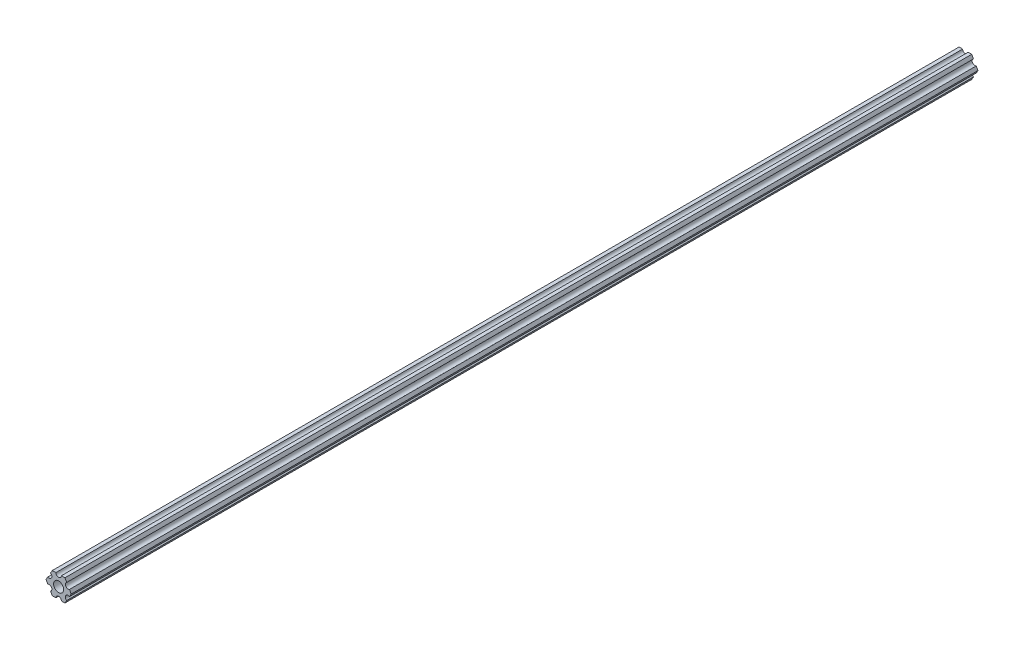
ISO-10303-21;
HEADER;
FILE_DESCRIPTION(('STEP AP214'),'2;1');
FILE_NAME('part.step','',(''),(''),'','','');
FILE_SCHEMA(('AUTOMOTIVE_DESIGN { 1 0 10303 214 1 1 1 1 }'));
ENDSEC;
DATA;
#1=APPLICATION_CONTEXT('core data for automotive mechanical design processes');
#2=APPLICATION_PROTOCOL_DEFINITION('international standard','automotive_design',2000,#1);
#3=PRODUCT_CONTEXT('',#1,'mechanical');
#4=PRODUCT('Part','Part','',(#3));
#5=PRODUCT_RELATED_PRODUCT_CATEGORY('part','',(#4));
#6=PRODUCT_DEFINITION_FORMATION('','',#4);
#7=PRODUCT_DEFINITION_CONTEXT('part definition',#1,'design');
#8=PRODUCT_DEFINITION('design','',#6,#7);
#9=PRODUCT_DEFINITION_SHAPE('','',#8);
#10=(LENGTH_UNIT() NAMED_UNIT(*) SI_UNIT(.MILLI.,.METRE.));
#11=(NAMED_UNIT(*) PLANE_ANGLE_UNIT() SI_UNIT($,.RADIAN.));
#12=(NAMED_UNIT(*) SI_UNIT($,.STERADIAN.) SOLID_ANGLE_UNIT());
#13=UNCERTAINTY_MEASURE_WITH_UNIT(LENGTH_MEASURE(1.E-05),#10,'distance_accuracy_value','');
#14=(GEOMETRIC_REPRESENTATION_CONTEXT(3) GLOBAL_UNCERTAINTY_ASSIGNED_CONTEXT((#13)) GLOBAL_UNIT_ASSIGNED_CONTEXT((#10,
#11,#12)) REPRESENTATION_CONTEXT('',''));
#15=CARTESIAN_POINT('',(0.,0.,0.));
#16=DIRECTION('',(0.,0.,1.));
#17=DIRECTION('',(1.,0.,0.));
#18=AXIS2_PLACEMENT_3D('',#15,#16,#17);
#19=CARTESIAN_POINT('',(6.29301142309098,-1.80018429024546,514.35));
#20=DIRECTION('',(-0.866025434075723,0.499999947533953,0.));
#21=DIRECTION('',(-0.499999947533953,-0.866025434075723,0.));
#22=AXIS2_PLACEMENT_3D('',#19,#20,#21);
#23=PLANE('',#22);
#24=DIRECTION('',(0.,0.,1.));
#25=VECTOR('',#24,1.);
#26=CARTESIAN_POINT('',(7.33234841870826,4.44212519169686E-07,514.35));
#27=LINE('',#26,#25);
#28=CARTESIAN_POINT('',(7.33234841870826,4.44212518961143E-07,0.));
#29=VERTEX_POINT('',#28);
#30=CARTESIAN_POINT('',(7.33234841870826,4.44212519315656E-07,527.05));
#31=VERTEX_POINT('',#30);
#32=EDGE_CURVE('E105',#29,#31,#27,.T.);
#33=ORIENTED_EDGE('',*,*,#32,.T.);
#34=DIRECTION('',(0.499999947533952,0.866025434075723,0.));
#35=VECTOR('',#34,1.);
#36=CARTESIAN_POINT('',(6.29301142309098,-1.80018429024546,527.05));
#37=LINE('',#36,#35);
#38=CARTESIAN_POINT('',(6.29301142309098,-1.80018429024546,527.05));
#39=VERTEX_POINT('',#38);
#40=EDGE_CURVE('E292',#39,#31,#37,.T.);
#41=ORIENTED_EDGE('',*,*,#40,.F.);
#42=DIRECTION('',(0.,0.,-1.));
#43=VECTOR('',#42,1.);
#44=CARTESIAN_POINT('',(6.29301142309098,-1.80018429024546,514.35));
#45=LINE('',#44,#43);
#46=CARTESIAN_POINT('',(6.29301142309098,-1.80018429024546,0.));
#47=VERTEX_POINT('',#46);
#48=EDGE_CURVE('E55',#39,#47,#45,.T.);
#49=ORIENTED_EDGE('',*,*,#48,.T.);
#50=DIRECTION('',(0.499999947533953,0.866025434075723,0.));
#51=VECTOR('',#50,1.);
#52=CARTESIAN_POINT('',(6.29301142309098,-1.80018429024546,0.));
#53=LINE('',#52,#51);
#54=EDGE_CURVE('E46',#47,#29,#53,.T.);
#55=ORIENTED_EDGE('',*,*,#54,.T.);
#56=EDGE_LOOP('',(#33,#41,#49,#55));
#57=FACE_BOUND('',#56,.T.);
#58=ADVANCED_FACE('F37',(#57),#23,.F.);
#59=CARTESIAN_POINT('',(7.33234841870826,4.44212519169686E-07,514.35));
#60=DIRECTION('',(-0.866025373493145,-0.500000052466056,0.));
#61=DIRECTION('',(0.500000052466056,-0.866025373493145,0.));
#62=AXIS2_PLACEMENT_3D('',#59,#60,#61);
#63=PLANE('',#62);
#64=DIRECTION('',(0.,0.,-1.));
#65=VECTOR('',#64,1.);
#66=CARTESIAN_POINT('',(6.29301120497139,1.80018505273895,514.35));
#67=LINE('',#66,#65);
#68=CARTESIAN_POINT('',(6.29301120497139,1.80018505273895,0.));
#69=VERTEX_POINT('',#68);
#70=CARTESIAN_POINT('',(6.29301120497139,1.80018505273895,527.05));
#71=VERTEX_POINT('',#70);
#72=EDGE_CURVE('E97',#69,#71,#67,.F.);
#73=ORIENTED_EDGE('',*,*,#72,.T.);
#74=DIRECTION('',(-0.500000052466056,0.866025373493145,0.));
#75=VECTOR('',#74,1.);
#76=CARTESIAN_POINT('',(7.33234841870826,4.44212519315656E-07,527.05));
#77=LINE('',#76,#75);
#78=EDGE_CURVE('E289',#31,#71,#77,.T.);
#79=ORIENTED_EDGE('',*,*,#78,.F.);
#80=ORIENTED_EDGE('',*,*,#32,.F.);
#81=DIRECTION('',(-0.500000052466056,0.866025373493145,0.));
#82=VECTOR('',#81,1.);
#83=CARTESIAN_POINT('',(7.33234841870826,4.44212519198905E-07,0.));
#84=LINE('',#83,#82);
#85=EDGE_CURVE('E160',#29,#69,#84,.T.);
#86=ORIENTED_EDGE('',*,*,#85,.T.);
#87=EDGE_LOOP('',(#73,#79,#80,#86));
#88=FACE_BOUND('',#87,.T.);
#89=ADVANCED_FACE('F341',(#88),#63,.F.);
#90=CARTESIAN_POINT('',(5.49926112168156,3.17500033315933,514.35));
#91=DIRECTION('',(0.,0.,-1.));
#92=DIRECTION('',(-1.,0.,0.));
#93=AXIS2_PLACEMENT_3D('',#90,#91,#92);
#94=CYLINDRICAL_SURFACE('',#93,1.5875);
#95=DIRECTION('',(0.,0.,1.));
#96=VECTOR('',#95,1.);
#97=CARTESIAN_POINT('',(4.70551103839172,4.54981561357972,514.35));
#98=LINE('',#97,#96);
#99=CARTESIAN_POINT('',(4.70551103839172,4.54981561357972,0.));
#100=VERTEX_POINT('',#99);
#101=CARTESIAN_POINT('',(4.70551103839172,4.54981561357972,527.05));
#102=VERTEX_POINT('',#101);
#103=EDGE_CURVE('E145',#100,#102,#98,.T.);
#104=ORIENTED_EDGE('',*,*,#103,.T.);
#105=CARTESIAN_POINT('',(5.49926112168156,3.17500033315933,527.05));
#106=DIRECTION('',(0.,0.,-1.));
#107=DIRECTION('',(1.,0.,0.));
#108=AXIS2_PLACEMENT_3D('',#105,#106,#107);
#109=CIRCLE('',#108,1.5875);
#110=EDGE_CURVE('E286',#71,#102,#109,.T.);
#111=ORIENTED_EDGE('',*,*,#110,.F.);
#112=ORIENTED_EDGE('',*,*,#72,.F.);
#113=CARTESIAN_POINT('',(5.49926112168156,3.17500033315933,0.));
#114=DIRECTION('',(0.,0.,-1.));
#115=DIRECTION('',(-1.,0.,0.));
#116=AXIS2_PLACEMENT_3D('',#113,#114,#115);
#117=CIRCLE('',#116,1.5875);
#118=EDGE_CURVE('E40',#69,#100,#117,.T.);
#119=ORIENTED_EDGE('',*,*,#118,.T.);
#120=EDGE_LOOP('',(#104,#111,#112,#119));
#121=FACE_BOUND('',#120,.T.);
#122=ADVANCED_FACE('F345',(#121),#94,.F.);
#123=CARTESIAN_POINT('',(4.70551103839172,4.54981561357972,514.35));
#124=DIRECTION('',(-0.866025373493151,-0.500000052466046,0.));
#125=DIRECTION('',(0.500000052466046,-0.866025373493151,0.));
#126=AXIS2_PLACEMENT_3D('',#123,#124,#125);
#127=PLANE('',#126);
#128=DIRECTION('',(0.,0.,1.));
#129=VECTOR('',#128,1.);
#130=CARTESIAN_POINT('',(3.66617382465481,6.35000022210627,514.35));
#131=LINE('',#130,#129);
#132=CARTESIAN_POINT('',(3.66617382465481,6.35000022210627,-1.11022302462516E-13));
#133=VERTEX_POINT('',#132);
#134=CARTESIAN_POINT('',(3.66617382465481,6.35000022210627,527.05));
#135=VERTEX_POINT('',#134);
#136=EDGE_CURVE('E132',#133,#135,#131,.T.);
#137=ORIENTED_EDGE('',*,*,#136,.T.);
#138=DIRECTION('',(-0.500000052466045,0.866025373493151,0.));
#139=VECTOR('',#138,1.);
#140=CARTESIAN_POINT('',(4.70551103839172,4.54981561357972,527.05));
#141=LINE('',#140,#139);
#142=EDGE_CURVE('E284',#102,#135,#141,.T.);
#143=ORIENTED_EDGE('',*,*,#142,.F.);
#144=ORIENTED_EDGE('',*,*,#103,.F.);
#145=DIRECTION('',(-0.500000052466046,0.866025373493151,0.));
#146=VECTOR('',#145,1.);
#147=CARTESIAN_POINT('',(4.70551103839172,4.54981561357972,0.));
#148=LINE('',#147,#146);
#149=EDGE_CURVE('E151',#100,#133,#148,.T.);
#150=ORIENTED_EDGE('',*,*,#149,.T.);
#151=EDGE_LOOP('',(#137,#143,#144,#150));
#152=FACE_BOUND('',#151,.T.);
#153=ADVANCED_FACE('F157',(#152),#127,.F.);
#154=CARTESIAN_POINT('',(3.66617382465481,6.35000022210627,514.35));
#155=DIRECTION('',(6.05825850611185E-08,-0.999999999999998,0.));
#156=DIRECTION('',(0.999999999999998,6.05825850611185E-08,0.));
#157=AXIS2_PLACEMENT_3D('',#154,#155,#156);
#158=PLANE('',#157);
#159=DIRECTION('',(0.,0.,-1.));
#160=VECTOR('',#159,1.);
#161=CARTESIAN_POINT('',(1.58749961530074,6.35000009617482,514.35));
#162=LINE('',#161,#160);
#163=CARTESIAN_POINT('',(1.58749961530073,6.35000015914054,0.));
#164=VERTEX_POINT('',#163);
#165=CARTESIAN_POINT('',(1.58749961530073,6.35000015914054,527.05));
#166=VERTEX_POINT('',#165);
#167=EDGE_CURVE('E144',#164,#166,#162,.F.);
#168=ORIENTED_EDGE('',*,*,#167,.T.);
#169=DIRECTION('',(-1.,-3.02912927391926E-08,0.));
#170=VECTOR('',#169,1.);
#171=CARTESIAN_POINT('',(3.66617382465481,6.35000022210627,527.05));
#172=LINE('',#171,#170);
#173=EDGE_CURVE('E139',#135,#166,#172,.T.);
#174=ORIENTED_EDGE('',*,*,#173,.F.);
#175=ORIENTED_EDGE('',*,*,#136,.F.);
#176=DIRECTION('',(1.,0.,0.));
#177=VECTOR('',#176,1.);
#178=CARTESIAN_POINT('',(5.49926112168156,6.35000022210627,0.));
#179=LINE('',#178,#177);
#180=EDGE_CURVE('E136',#133,#164,#179,.F.);
#181=ORIENTED_EDGE('',*,*,#180,.T.);
#182=EDGE_LOOP('',(#168,#174,#175,#181));
#183=FACE_BOUND('',#182,.T.);
#184=ADVANCED_FACE('F135',(#183),#158,.F.);
#185=CARTESIAN_POINT('',(-3.84699260060323E-07,6.35,514.35));
#186=DIRECTION('',(0.,0.,-1.));
#187=DIRECTION('',(-1.,0.,0.));
#188=AXIS2_PLACEMENT_3D('',#185,#186,#187);
#189=CYLINDRICAL_SURFACE('',#188,1.5875);
#190=DIRECTION('',(0.,0.,1.));
#191=VECTOR('',#190,1.);
#192=CARTESIAN_POINT('',(-1.58750038469926,6.34999990382518,514.35));
#193=LINE('',#192,#191);
#194=CARTESIAN_POINT('',(-1.58750038469926,6.34999990382518,0.));
#195=VERTEX_POINT('',#194);
#196=CARTESIAN_POINT('',(-1.58750038469926,6.34999990382519,527.05));
#197=VERTEX_POINT('',#196);
#198=EDGE_CURVE('E206',#195,#197,#193,.T.);
#199=ORIENTED_EDGE('',*,*,#198,.T.);
#200=CARTESIAN_POINT('',(-3.84699260060323E-07,6.35,527.05));
#201=DIRECTION('',(0.,0.,-1.));
#202=DIRECTION('',(1.,0.,0.));
#203=AXIS2_PLACEMENT_3D('',#200,#201,#202);
#204=CIRCLE('',#203,1.5875);
#205=EDGE_CURVE('E280',#166,#197,#204,.T.);
#206=ORIENTED_EDGE('',*,*,#205,.F.);
#207=ORIENTED_EDGE('',*,*,#167,.F.);
#208=CARTESIAN_POINT('',(-3.84699260060323E-07,6.35,0.));
#209=DIRECTION('',(0.,0.,-1.));
#210=DIRECTION('',(-1.,0.,0.));
#211=AXIS2_PLACEMENT_3D('',#208,#209,#210);
#212=CIRCLE('',#211,1.5875);
#213=EDGE_CURVE('E154',#164,#195,#212,.T.);
#214=ORIENTED_EDGE('',*,*,#213,.T.);
#215=EDGE_LOOP('',(#199,#206,#207,#214));
#216=FACE_BOUND('',#215,.T.);
#217=ADVANCED_FACE('F359',(#216),#189,.F.);
#218=CARTESIAN_POINT('',(-1.58750038469926,6.34999990382518,514.35));
#219=DIRECTION('',(6.05825963273174E-08,-0.999999999999998,0.));
#220=DIRECTION('',(0.999999999999998,6.05825963273174E-08,0.));
#221=AXIS2_PLACEMENT_3D('',#218,#219,#220);
#222=PLANE('',#221);
#223=DIRECTION('',(0.,0.,1.));
#224=VECTOR('',#223,1.);
#225=CARTESIAN_POINT('',(-3.66617459405349,6.3499997778937,514.35));
#226=LINE('',#225,#224);
#227=CARTESIAN_POINT('',(-3.66617454558244,6.34999986184803,-1.11022302462516E-13));
#228=VERTEX_POINT('',#227);
#229=CARTESIAN_POINT('',(-3.66617454558244,6.34999986184803,527.05));
#230=VERTEX_POINT('',#229);
#231=EDGE_CURVE('E204',#228,#230,#226,.T.);
#232=ORIENTED_EDGE('',*,*,#231,.T.);
#233=DIRECTION('',(-1.,-2.0194198968488E-08,0.));
#234=VECTOR('',#233,1.);
#235=CARTESIAN_POINT('',(-1.58750038469926,6.34999990382518,527.05));
#236=LINE('',#235,#234);
#237=EDGE_CURVE('E277',#197,#230,#236,.T.);
#238=ORIENTED_EDGE('',*,*,#237,.F.);
#239=ORIENTED_EDGE('',*,*,#198,.F.);
#240=DIRECTION('',(1.,0.,0.));
#241=VECTOR('',#240,1.);
#242=CARTESIAN_POINT('',(5.49926112168156,6.34999990382518,0.));
#243=LINE('',#242,#241);
#244=EDGE_CURVE('E238',#195,#228,#243,.F.);
#245=ORIENTED_EDGE('',*,*,#244,.T.);
#246=EDGE_LOOP('',(#232,#238,#239,#245));
#247=FACE_BOUND('',#246,.T.);
#248=ADVANCED_FACE('F361',(#247),#222,.F.);
#249=CARTESIAN_POINT('',(-3.66617459405349,6.3499997778937,514.35));
#250=DIRECTION('',(0.866025434075729,-0.499999947533942,0.));
#251=DIRECTION('',(0.499999947533942,0.866025434075729,0.));
#252=AXIS2_PLACEMENT_3D('',#249,#250,#251);
#253=PLANE('',#252);
#254=DIRECTION('',(0.,0.,-1.));
#255=VECTOR('',#254,1.);
#256=CARTESIAN_POINT('',(-4.70551158967065,4.54981504343587,514.35));
#257=LINE('',#256,#255);
#258=CARTESIAN_POINT('',(-4.70551158967065,4.54981504343587,0.));
#259=VERTEX_POINT('',#258);
#260=CARTESIAN_POINT('',(-4.70551158967065,4.54981504343587,527.05));
#261=VERTEX_POINT('',#260);
#262=EDGE_CURVE('E113',#259,#261,#257,.F.);
#263=ORIENTED_EDGE('',*,*,#262,.T.);
#264=DIRECTION('',(-0.499999947533942,-0.866025434075729,0.));
#265=VECTOR('',#264,1.);
#266=CARTESIAN_POINT('',(-3.66617454558244,6.34999986184803,527.05));
#267=LINE('',#266,#265);
#268=EDGE_CURVE('E217',#230,#261,#267,.T.);
#269=ORIENTED_EDGE('',*,*,#268,.F.);
#270=ORIENTED_EDGE('',*,*,#231,.F.);
#271=DIRECTION('',(-0.499999947533943,-0.866025434075729,0.));
#272=VECTOR('',#271,1.);
#273=CARTESIAN_POINT('',(-3.66617459405349,6.3499997778937,0.));
#274=LINE('',#273,#272);
#275=EDGE_CURVE('E237',#228,#259,#274,.T.);
#276=ORIENTED_EDGE('',*,*,#275,.T.);
#277=EDGE_LOOP('',(#263,#269,#270,#276));
#278=FACE_BOUND('',#277,.T.);
#279=ADVANCED_FACE('F363',(#278),#253,.F.);
#280=CARTESIAN_POINT('',(-5.49926150638082,3.17499966684067,514.35));
#281=DIRECTION('',(0.,0.,-1.));
#282=DIRECTION('',(-1.,0.,0.));
#283=AXIS2_PLACEMENT_3D('',#280,#281,#282);
#284=CYLINDRICAL_SURFACE('',#283,1.5875);
#285=DIRECTION('',(0.,0.,1.));
#286=VECTOR('',#285,1.);
#287=CARTESIAN_POINT('',(-6.29301142309098,1.80018429024547,514.35));
#288=LINE('',#287,#286);
#289=CARTESIAN_POINT('',(-6.29301142309098,1.80018429024547,0.));
#290=VERTEX_POINT('',#289);
#291=CARTESIAN_POINT('',(-6.29301142309098,1.80018429024547,527.05));
#292=VERTEX_POINT('',#291);
#293=EDGE_CURVE('E198',#290,#292,#288,.T.);
#294=ORIENTED_EDGE('',*,*,#293,.T.);
#295=CARTESIAN_POINT('',(-5.49926150638082,3.17499966684067,527.05));
#296=DIRECTION('',(0.,0.,-1.));
#297=DIRECTION('',(1.,0.,0.));
#298=AXIS2_PLACEMENT_3D('',#295,#296,#297);
#299=CIRCLE('',#298,1.5875);
#300=EDGE_CURVE('E322',#261,#292,#299,.T.);
#301=ORIENTED_EDGE('',*,*,#300,.F.);
#302=ORIENTED_EDGE('',*,*,#262,.F.);
#303=CARTESIAN_POINT('',(-5.49926150638082,3.17499966684067,0.));
#304=DIRECTION('',(0.,0.,-1.));
#305=DIRECTION('',(-1.,0.,0.));
#306=AXIS2_PLACEMENT_3D('',#303,#304,#305);
#307=CIRCLE('',#306,1.5875);
#308=EDGE_CURVE('E234',#259,#290,#307,.T.);
#309=ORIENTED_EDGE('',*,*,#308,.T.);
#310=EDGE_LOOP('',(#294,#301,#302,#309));
#311=FACE_BOUND('',#310,.T.);
#312=ADVANCED_FACE('F368',(#311),#284,.F.);
#313=CARTESIAN_POINT('',(-6.29301142309098,1.80018429024547,514.35));
#314=DIRECTION('',(0.866025434075724,-0.499999947533951,0.));
#315=DIRECTION('',(0.499999947533951,0.866025434075724,0.));
#316=AXIS2_PLACEMENT_3D('',#313,#314,#315);
#317=PLANE('',#316);
#318=DIRECTION('',(0.,0.,1.));
#319=VECTOR('',#318,1.);
#320=CARTESIAN_POINT('',(-7.33234841870826,-4.44212523790841E-07,514.35));
#321=LINE('',#320,#319);
#322=CARTESIAN_POINT('',(-7.33234841870826,-4.44212524036367E-07,0.));
#323=VERTEX_POINT('',#322);
#324=CARTESIAN_POINT('',(-7.33234841870826,-4.44212524036367E-07,527.05));
#325=VERTEX_POINT('',#324);
#326=EDGE_CURVE('E195',#323,#325,#321,.T.);
#327=ORIENTED_EDGE('',*,*,#326,.T.);
#328=DIRECTION('',(-0.499999947533951,-0.866025434075724,0.));
#329=VECTOR('',#328,1.);
#330=CARTESIAN_POINT('',(-6.29301142309098,1.80018429024547,527.05));
#331=LINE('',#330,#329);
#332=EDGE_CURVE('E319',#292,#325,#331,.T.);
#333=ORIENTED_EDGE('',*,*,#332,.F.);
#334=ORIENTED_EDGE('',*,*,#293,.F.);
#335=DIRECTION('',(-0.499999947533952,-0.866025434075724,0.));
#336=VECTOR('',#335,1.);
#337=CARTESIAN_POINT('',(-6.29301142309098,1.80018429024547,0.));
#338=LINE('',#337,#336);
#339=EDGE_CURVE('E236',#290,#323,#338,.T.);
#340=ORIENTED_EDGE('',*,*,#339,.T.);
#341=EDGE_LOOP('',(#327,#333,#334,#340));
#342=FACE_BOUND('',#341,.T.);
#343=ADVANCED_FACE('F412',(#342),#317,.F.);
#344=CARTESIAN_POINT('',(-7.33234841870826,-4.44212523790841E-07,514.35));
#345=DIRECTION('',(0.866025373493151,0.500000052466045,0.));
#346=DIRECTION('',(-0.500000052466045,0.866025373493151,0.));
#347=AXIS2_PLACEMENT_3D('',#344,#345,#346);
#348=PLANE('',#347);
#349=DIRECTION('',(0.,0.,-1.));
#350=VECTOR('',#349,1.);
#351=CARTESIAN_POINT('',(-6.29301120497141,-1.80018505273896,514.35));
#352=LINE('',#351,#350);
#353=CARTESIAN_POINT('',(-6.29301120497141,-1.80018505273896,0.));
#354=VERTEX_POINT('',#353);
#355=CARTESIAN_POINT('',(-6.29301120497141,-1.80018505273896,527.05));
#356=VERTEX_POINT('',#355);
#357=EDGE_CURVE('E192',#354,#356,#352,.F.);
#358=ORIENTED_EDGE('',*,*,#357,.T.);
#359=DIRECTION('',(0.500000052466045,-0.866025373493151,0.));
#360=VECTOR('',#359,1.);
#361=CARTESIAN_POINT('',(-7.33234841870826,-4.44212524036367E-07,527.05));
#362=LINE('',#361,#360);
#363=EDGE_CURVE('E316',#325,#356,#362,.T.);
#364=ORIENTED_EDGE('',*,*,#363,.F.);
#365=ORIENTED_EDGE('',*,*,#326,.F.);
#366=DIRECTION('',(0.500000052466045,-0.866025373493151,0.));
#367=VECTOR('',#366,1.);
#368=CARTESIAN_POINT('',(-7.33234841870826,-4.44212523969395E-07,0.));
#369=LINE('',#368,#367);
#370=EDGE_CURVE('E233',#323,#354,#369,.T.);
#371=ORIENTED_EDGE('',*,*,#370,.T.);
#372=EDGE_LOOP('',(#358,#364,#365,#371));
#373=FACE_BOUND('',#372,.T.);
#374=ADVANCED_FACE('F415',(#373),#348,.F.);
#375=CARTESIAN_POINT('',(-5.49926112168156,-3.17500033315934,514.35));
#376=DIRECTION('',(0.,0.,-1.));
#377=DIRECTION('',(-1.,0.,0.));
#378=AXIS2_PLACEMENT_3D('',#375,#376,#377);
#379=CYLINDRICAL_SURFACE('',#378,1.5875);
#380=DIRECTION('',(0.,0.,1.));
#381=VECTOR('',#380,1.);
#382=CARTESIAN_POINT('',(-4.70551103839172,-4.54981561357972,514.35));
#383=LINE('',#382,#381);
#384=CARTESIAN_POINT('',(-4.70551103839172,-4.54981561357972,0.));
#385=VERTEX_POINT('',#384);
#386=CARTESIAN_POINT('',(-4.70551103839172,-4.54981561357972,527.05));
#387=VERTEX_POINT('',#386);
#388=EDGE_CURVE('E187',#385,#387,#383,.T.);
#389=ORIENTED_EDGE('',*,*,#388,.T.);
#390=CARTESIAN_POINT('',(-5.49926112168156,-3.17500033315934,527.05));
#391=DIRECTION('',(0.,0.,-1.));
#392=DIRECTION('',(1.,0.,0.));
#393=AXIS2_PLACEMENT_3D('',#390,#391,#392);
#394=CIRCLE('',#393,1.5875);
#395=EDGE_CURVE('E313',#356,#387,#394,.T.);
#396=ORIENTED_EDGE('',*,*,#395,.F.);
#397=ORIENTED_EDGE('',*,*,#357,.F.);
#398=CARTESIAN_POINT('',(-5.49926112168156,-3.17500033315934,0.));
#399=DIRECTION('',(0.,0.,-1.));
#400=DIRECTION('',(-1.,0.,0.));
#401=AXIS2_PLACEMENT_3D('',#398,#399,#400);
#402=CIRCLE('',#401,1.5875);
#403=EDGE_CURVE('E229',#354,#385,#402,.T.);
#404=ORIENTED_EDGE('',*,*,#403,.T.);
#405=EDGE_LOOP('',(#389,#396,#397,#404));
#406=FACE_BOUND('',#405,.T.);
#407=ADVANCED_FACE('F419',(#406),#379,.F.);
#408=CARTESIAN_POINT('',(-4.70551103839172,-4.54981561357972,514.35));
#409=DIRECTION('',(0.866025373493151,0.500000052466045,0.));
#410=DIRECTION('',(-0.500000052466045,0.866025373493151,0.));
#411=AXIS2_PLACEMENT_3D('',#408,#409,#410);
#412=PLANE('',#411);
#413=DIRECTION('',(0.,0.,1.));
#414=VECTOR('',#413,1.);
#415=CARTESIAN_POINT('',(-3.66617382465481,-6.35000022210628,514.35));
#416=LINE('',#415,#414);
#417=CARTESIAN_POINT('',(-3.6661738246548,-6.35000022210628,-1.11022302462516E-13));
#418=VERTEX_POINT('',#417);
#419=CARTESIAN_POINT('',(-3.6661738246548,-6.35000022210628,527.05));
#420=VERTEX_POINT('',#419);
#421=EDGE_CURVE('E184',#418,#420,#416,.T.);
#422=ORIENTED_EDGE('',*,*,#421,.T.);
#423=DIRECTION('',(0.500000052466045,-0.866025373493151,0.));
#424=VECTOR('',#423,1.);
#425=CARTESIAN_POINT('',(-4.70551103839172,-4.54981561357972,527.05));
#426=LINE('',#425,#424);
#427=EDGE_CURVE('E310',#387,#420,#426,.T.);
#428=ORIENTED_EDGE('',*,*,#427,.F.);
#429=ORIENTED_EDGE('',*,*,#388,.F.);
#430=DIRECTION('',(0.500000052466045,-0.866025373493151,0.));
#431=VECTOR('',#430,1.);
#432=CARTESIAN_POINT('',(-4.70551103839172,-4.54981561357972,0.));
#433=LINE('',#432,#431);
#434=EDGE_CURVE('E232',#385,#418,#433,.T.);
#435=ORIENTED_EDGE('',*,*,#434,.T.);
#436=EDGE_LOOP('',(#422,#428,#429,#435));
#437=FACE_BOUND('',#436,.T.);
#438=ADVANCED_FACE('F423',(#437),#412,.F.);
#439=CARTESIAN_POINT('',(-3.66617382465481,-6.35000022210628,514.35));
#440=DIRECTION('',(-6.05825854783851E-08,0.999999999999998,0.));
#441=DIRECTION('',(-0.999999999999998,-6.05825854783851E-08,0.));
#442=AXIS2_PLACEMENT_3D('',#439,#440,#441);
#443=PLANE('',#442);
#444=DIRECTION('',(0.,0.,-1.));
#445=VECTOR('',#444,1.);
#446=CARTESIAN_POINT('',(-1.58749961530074,-6.35,514.35));
#447=LINE('',#446,#445);
#448=CARTESIAN_POINT('',(-1.58749961530073,-6.35000011105314,0.));
#449=VERTEX_POINT('',#448);
#450=CARTESIAN_POINT('',(-1.58749961530073,-6.35000011105314,527.05));
#451=VERTEX_POINT('',#450);
#452=EDGE_CURVE('E181',#449,#451,#447,.F.);
#453=ORIENTED_EDGE('',*,*,#452,.T.);
#454=DIRECTION('',(0.999999999999998,5.34249835485697E-08,0.));
#455=VECTOR('',#454,1.);
#456=CARTESIAN_POINT('',(-3.6661738246548,-6.35000022210628,527.05));
#457=LINE('',#456,#455);
#458=EDGE_CURVE('E307',#420,#451,#457,.T.);
#459=ORIENTED_EDGE('',*,*,#458,.F.);
#460=ORIENTED_EDGE('',*,*,#421,.F.);
#461=DIRECTION('',(1.,0.,0.));
#462=VECTOR('',#461,1.);
#463=CARTESIAN_POINT('',(5.49926112168156,-6.35000022210628,0.));
#464=LINE('',#463,#462);
#465=EDGE_CURVE('E228',#418,#449,#464,.T.);
#466=ORIENTED_EDGE('',*,*,#465,.T.);
#467=EDGE_LOOP('',(#453,#459,#460,#466));
#468=FACE_BOUND('',#467,.T.);
#469=ADVANCED_FACE('F427',(#468),#443,.F.);
#470=CARTESIAN_POINT('',(3.8469926204343E-07,-6.35,514.35));
#471=DIRECTION('',(0.,0.,-1.));
#472=DIRECTION('',(-1.,0.,0.));
#473=AXIS2_PLACEMENT_3D('',#470,#471,#472);
#474=CYLINDRICAL_SURFACE('',#473,1.5875);
#475=DIRECTION('',(0.,0.,1.));
#476=VECTOR('',#475,1.);
#477=CARTESIAN_POINT('',(1.58750038469926,-6.34999990382518,514.35));
#478=LINE('',#477,#476);
#479=CARTESIAN_POINT('',(1.58750038469926,-6.34999990382518,0.));
#480=VERTEX_POINT('',#479);
#481=CARTESIAN_POINT('',(1.58750038469926,-6.34999990382518,527.05));
#482=VERTEX_POINT('',#481);
#483=EDGE_CURVE('E176',#480,#482,#478,.T.);
#484=ORIENTED_EDGE('',*,*,#483,.T.);
#485=CARTESIAN_POINT('',(3.8469926204343E-07,-6.35,527.05));
#486=DIRECTION('',(0.,0.,-1.));
#487=DIRECTION('',(1.,0.,0.));
#488=AXIS2_PLACEMENT_3D('',#485,#486,#487);
#489=CIRCLE('',#488,1.5875);
#490=EDGE_CURVE('E304',#451,#482,#489,.T.);
#491=ORIENTED_EDGE('',*,*,#490,.F.);
#492=ORIENTED_EDGE('',*,*,#452,.F.);
#493=CARTESIAN_POINT('',(3.8469926204343E-07,-6.35,0.));
#494=DIRECTION('',(0.,0.,-1.));
#495=DIRECTION('',(-1.,0.,0.));
#496=AXIS2_PLACEMENT_3D('',#493,#494,#495);
#497=CIRCLE('',#496,1.5875);
#498=EDGE_CURVE('E224',#449,#480,#497,.T.);
#499=ORIENTED_EDGE('',*,*,#498,.T.);
#500=EDGE_LOOP('',(#484,#491,#492,#499));
#501=FACE_BOUND('',#500,.T.);
#502=ADVANCED_FACE('F431',(#501),#474,.F.);
#503=CARTESIAN_POINT('',(1.58750038469926,-6.34999990382518,514.35));
#504=DIRECTION('',(-6.05825721258438E-08,0.999999999999998,0.));
#505=DIRECTION('',(-0.999999999999998,-6.05825721258438E-08,0.));
#506=AXIS2_PLACEMENT_3D('',#503,#504,#505);
#507=PLANE('',#506);
#508=DIRECTION('',(0.,0.,1.));
#509=VECTOR('',#508,1.);
#510=CARTESIAN_POINT('',(3.66617459405346,-6.34999977789375,514.35));
#511=LINE('',#510,#509);
#512=CARTESIAN_POINT('',(3.66617454558244,-6.34999986184804,-1.11022302462516E-13));
#513=VERTEX_POINT('',#512);
#514=CARTESIAN_POINT('',(3.66617454558244,-6.34999986184804,527.05));
#515=VERTEX_POINT('',#514);
#516=EDGE_CURVE('E173',#513,#515,#511,.T.);
#517=ORIENTED_EDGE('',*,*,#516,.T.);
#518=DIRECTION('',(1.,2.01941910404187E-08,0.));
#519=VECTOR('',#518,1.);
#520=CARTESIAN_POINT('',(1.58750038469926,-6.34999990382518,527.05));
#521=LINE('',#520,#519);
#522=EDGE_CURVE('E301',#482,#515,#521,.T.);
#523=ORIENTED_EDGE('',*,*,#522,.F.);
#524=ORIENTED_EDGE('',*,*,#483,.F.);
#525=DIRECTION('',(1.,0.,0.));
#526=VECTOR('',#525,1.);
#527=CARTESIAN_POINT('',(5.49926112168156,-6.34999990382518,0.));
#528=LINE('',#527,#526);
#529=EDGE_CURVE('E227',#480,#513,#528,.T.);
#530=ORIENTED_EDGE('',*,*,#529,.T.);
#531=EDGE_LOOP('',(#517,#523,#524,#530));
#532=FACE_BOUND('',#531,.T.);
#533=ADVANCED_FACE('F435',(#532),#507,.F.);
#534=CARTESIAN_POINT('',(3.66617459405346,-6.34999977789375,514.35));
#535=DIRECTION('',(-0.86602543407573,0.499999947533941,0.));
#536=DIRECTION('',(-0.499999947533941,-0.86602543407573,0.));
#537=AXIS2_PLACEMENT_3D('',#534,#535,#536);
#538=PLANE('',#537);
#539=DIRECTION('',(0.,0.,1.));
#540=VECTOR('',#539,1.);
#541=CARTESIAN_POINT('',(4.70551158967065,-4.54981504343587,514.35));
#542=LINE('',#541,#540);
#543=CARTESIAN_POINT('',(4.70551158967065,-4.54981504343587,527.05));
#544=VERTEX_POINT('',#543);
#545=CARTESIAN_POINT('',(4.70551158967065,-4.54981504343587,0.));
#546=VERTEX_POINT('',#545);
#547=EDGE_CURVE('E170',#544,#546,#542,.F.);
#548=ORIENTED_EDGE('',*,*,#547,.F.);
#549=DIRECTION('',(0.49999994753394,0.86602543407573,0.));
#550=VECTOR('',#549,1.);
#551=CARTESIAN_POINT('',(3.66617454558244,-6.34999986184804,527.05));
#552=LINE('',#551,#550);
#553=EDGE_CURVE('E298',#515,#544,#552,.T.);
#554=ORIENTED_EDGE('',*,*,#553,.F.);
#555=ORIENTED_EDGE('',*,*,#516,.F.);
#556=DIRECTION('',(0.49999994753394,0.86602543407573,0.));
#557=VECTOR('',#556,1.);
#558=CARTESIAN_POINT('',(3.66617459405346,-6.34999977789376,0.));
#559=LINE('',#558,#557);
#560=EDGE_CURVE('E223',#513,#546,#559,.T.);
#561=ORIENTED_EDGE('',*,*,#560,.T.);
#562=EDGE_LOOP('',(#548,#554,#555,#561));
#563=FACE_BOUND('',#562,.T.);
#564=ADVANCED_FACE('F439',(#563),#538,.F.);
#565=CARTESIAN_POINT('',(5.49926150638082,-3.17499966684067,514.35));
#566=DIRECTION('',(0.,0.,-1.));
#567=DIRECTION('',(-1.,0.,0.));
#568=AXIS2_PLACEMENT_3D('',#565,#566,#567);
#569=CYLINDRICAL_SURFACE('',#568,1.58750000000001);
#570=ORIENTED_EDGE('',*,*,#48,.F.);
#571=CARTESIAN_POINT('',(5.49926150638082,-3.17499966684067,527.05));
#572=DIRECTION('',(0.,0.,-1.));
#573=DIRECTION('',(1.,0.,0.));
#574=AXIS2_PLACEMENT_3D('',#571,#572,#573);
#575=CIRCLE('',#574,1.58750000000001);
#576=EDGE_CURVE('E295',#544,#39,#575,.T.);
#577=ORIENTED_EDGE('',*,*,#576,.F.);
#578=ORIENTED_EDGE('',*,*,#547,.T.);
#579=CARTESIAN_POINT('',(5.49926150638082,-3.17499966684067,0.));
#580=DIRECTION('',(0.,0.,-1.));
#581=DIRECTION('',(-1.,0.,0.));
#582=AXIS2_PLACEMENT_3D('',#579,#580,#581);
#583=CIRCLE('',#582,1.58750000000001);
#584=EDGE_CURVE('E220',#546,#47,#583,.T.);
#585=ORIENTED_EDGE('',*,*,#584,.T.);
#586=EDGE_LOOP('',(#570,#577,#578,#585));
#587=FACE_BOUND('',#586,.T.);
#588=ADVANCED_FACE('F392',(#587),#569,.F.);
#589=CARTESIAN_POINT('',(5.49926112168156,3.17500033315933,0.));
#590=DIRECTION('',(0.,0.,1.));
#591=DIRECTION('',(1.,0.,0.));
#592=AXIS2_PLACEMENT_3D('',#589,#590,#591);
#593=PLANE('',#592);
#594=CARTESIAN_POINT('',(0.,0.,0.));
#595=DIRECTION('',(0.,0.,-1.));
#596=DIRECTION('',(-1.,0.,0.));
#597=AXIS2_PLACEMENT_3D('',#594,#595,#596);
#598=CIRCLE('',#597,2.9337);
#599=CARTESIAN_POINT('',(-2.9337,0.,0.));
#600=VERTEX_POINT('',#599);
#601=EDGE_CURVE('E11',#600,#600,#598,.F.);
#602=ORIENTED_EDGE('',*,*,#601,.T.);
#603=EDGE_LOOP('',(#602));
#604=FACE_BOUND('',#603,.T.);
#605=ORIENTED_EDGE('',*,*,#584,.F.);
#606=ORIENTED_EDGE('',*,*,#560,.F.);
#607=ORIENTED_EDGE('',*,*,#529,.F.);
#608=ORIENTED_EDGE('',*,*,#498,.F.);
#609=ORIENTED_EDGE('',*,*,#465,.F.);
#610=ORIENTED_EDGE('',*,*,#434,.F.);
#611=ORIENTED_EDGE('',*,*,#403,.F.);
#612=ORIENTED_EDGE('',*,*,#370,.F.);
#613=ORIENTED_EDGE('',*,*,#339,.F.);
#614=ORIENTED_EDGE('',*,*,#308,.F.);
#615=ORIENTED_EDGE('',*,*,#275,.F.);
#616=ORIENTED_EDGE('',*,*,#244,.F.);
#617=ORIENTED_EDGE('',*,*,#213,.F.);
#618=ORIENTED_EDGE('',*,*,#180,.F.);
#619=ORIENTED_EDGE('',*,*,#149,.F.);
#620=ORIENTED_EDGE('',*,*,#118,.F.);
#621=ORIENTED_EDGE('',*,*,#85,.F.);
#622=ORIENTED_EDGE('',*,*,#54,.F.);
#623=EDGE_LOOP('',(#605,#606,#607,#608,#609,#610,#611,#612,#613,#614,#615,#616,#617,#618,#619,
#620,#621,#622));
#624=FACE_BOUND('',#623,.T.);
#625=ADVANCED_FACE('F150',(#604,#624),#593,.F.);
#626=CARTESIAN_POINT('',(0.,0.,514.35));
#627=DIRECTION('',(0.,0.,-1.));
#628=DIRECTION('',(-1.,0.,0.));
#629=AXIS2_PLACEMENT_3D('',#626,#627,#628);
#630=CYLINDRICAL_SURFACE('',#629,2.9337);
#631=ORIENTED_EDGE('',*,*,#601,.F.);
#632=EDGE_LOOP('',(#631));
#633=FACE_BOUND('',#632,.T.);
#634=CARTESIAN_POINT('',(0.,0.,527.05));
#635=DIRECTION('',(0.,0.,1.));
#636=DIRECTION('',(1.,0.,0.));
#637=AXIS2_PLACEMENT_3D('',#634,#635,#636);
#638=CIRCLE('',#637,2.9337);
#639=CARTESIAN_POINT('',(2.9337,0.,527.05));
#640=VERTEX_POINT('',#639);
#641=EDGE_CURVE('E325',#640,#640,#638,.T.);
#642=ORIENTED_EDGE('',*,*,#641,.T.);
#643=EDGE_LOOP('',(#642));
#644=FACE_BOUND('',#643,.T.);
#645=ADVANCED_FACE('F329',(#633,#644),#630,.F.);
#646=CARTESIAN_POINT('',(-5.49926150638082,3.17499966684067,527.05));
#647=DIRECTION('',(0.,0.,1.));
#648=DIRECTION('',(1.,0.,0.));
#649=AXIS2_PLACEMENT_3D('',#646,#647,#648);
#650=PLANE('',#649);
#651=ORIENTED_EDGE('',*,*,#300,.T.);
#652=ORIENTED_EDGE('',*,*,#332,.T.);
#653=ORIENTED_EDGE('',*,*,#363,.T.);
#654=ORIENTED_EDGE('',*,*,#395,.T.);
#655=ORIENTED_EDGE('',*,*,#427,.T.);
#656=ORIENTED_EDGE('',*,*,#458,.T.);
#657=ORIENTED_EDGE('',*,*,#490,.T.);
#658=ORIENTED_EDGE('',*,*,#522,.T.);
#659=ORIENTED_EDGE('',*,*,#553,.T.);
#660=ORIENTED_EDGE('',*,*,#576,.T.);
#661=ORIENTED_EDGE('',*,*,#40,.T.);
#662=ORIENTED_EDGE('',*,*,#78,.T.);
#663=ORIENTED_EDGE('',*,*,#110,.T.);
#664=ORIENTED_EDGE('',*,*,#142,.T.);
#665=ORIENTED_EDGE('',*,*,#173,.T.);
#666=ORIENTED_EDGE('',*,*,#205,.T.);
#667=ORIENTED_EDGE('',*,*,#237,.T.);
#668=ORIENTED_EDGE('',*,*,#268,.T.);
#669=EDGE_LOOP('',(#651,#652,#653,#654,#655,#656,#657,#658,#659,#660,#661,#662,#663,#664,#665,
#666,#667,#668));
#670=FACE_BOUND('',#669,.T.);
#671=ORIENTED_EDGE('',*,*,#641,.F.);
#672=EDGE_LOOP('',(#671));
#673=FACE_BOUND('',#672,.T.);
#674=ADVANCED_FACE('F331',(#670,#673),#650,.T.);
#675=CLOSED_SHELL('',(#58,#89,#122,#153,#184,#217,#248,#279,#312,#343,#374,#407,#438,#469,#502,
#533,#564,#588,#625,#645,#674));
#676=MANIFOLD_SOLID_BREP('B2',#675);
#677=ADVANCED_BREP_SHAPE_REPRESENTATION('',(#18,#676),#14);
#678=SHAPE_DEFINITION_REPRESENTATION(#9,#677);
ENDSEC;
END-ISO-10303-21;
